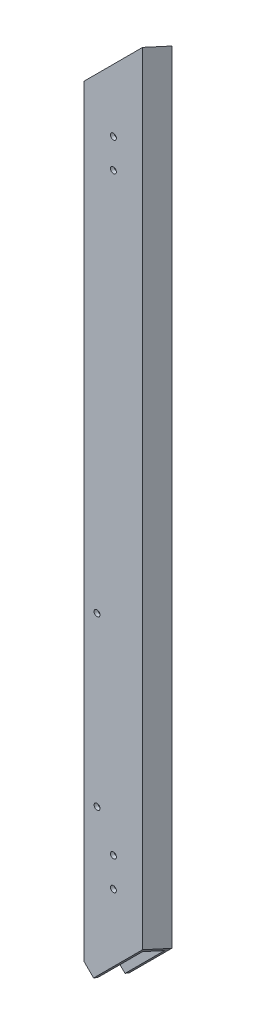
ISO-10303-21;
HEADER;
FILE_DESCRIPTION(('STEP AP214'),'2;1');
FILE_NAME('part.step','',(''),(''),'','','');
FILE_SCHEMA(('AUTOMOTIVE_DESIGN { 1 0 10303 214 1 1 1 1 }'));
ENDSEC;
DATA;
#1=APPLICATION_CONTEXT('core data for automotive mechanical design processes');
#2=APPLICATION_PROTOCOL_DEFINITION('international standard','automotive_design',2000,#1);
#3=PRODUCT_CONTEXT('',#1,'mechanical');
#4=PRODUCT('Part','Part','',(#3));
#5=PRODUCT_RELATED_PRODUCT_CATEGORY('part','',(#4));
#6=PRODUCT_DEFINITION_FORMATION('','',#4);
#7=PRODUCT_DEFINITION_CONTEXT('part definition',#1,'design');
#8=PRODUCT_DEFINITION('design','',#6,#7);
#9=PRODUCT_DEFINITION_SHAPE('','',#8);
#10=(LENGTH_UNIT() NAMED_UNIT(*) SI_UNIT(.MILLI.,.METRE.));
#11=(NAMED_UNIT(*) PLANE_ANGLE_UNIT() SI_UNIT($,.RADIAN.));
#12=(NAMED_UNIT(*) SI_UNIT($,.STERADIAN.) SOLID_ANGLE_UNIT());
#13=UNCERTAINTY_MEASURE_WITH_UNIT(LENGTH_MEASURE(1.E-05),#10,'distance_accuracy_value','');
#14=(GEOMETRIC_REPRESENTATION_CONTEXT(3) GLOBAL_UNCERTAINTY_ASSIGNED_CONTEXT((#13)) GLOBAL_UNIT_ASSIGNED_CONTEXT((#10,
#11,#12)) REPRESENTATION_CONTEXT('',''));
#15=CARTESIAN_POINT('',(0.,0.,0.));
#16=DIRECTION('',(0.,0.,1.));
#17=DIRECTION('',(1.,0.,0.));
#18=AXIS2_PLACEMENT_3D('',#15,#16,#17);
#19=CARTESIAN_POINT('',(-25.4,728.3704,12.7));
#20=DIRECTION('',(0.,0.,-1.));
#21=DIRECTION('',(-1.,0.,0.));
#22=AXIS2_PLACEMENT_3D('',#19,#20,#21);
#23=PLANE('',#22);
#24=CARTESIAN_POINT('',(-1.18245691016483E-10,81.4943735797498,12.7));
#25=DIRECTION('',(0.,0.,1.));
#26=DIRECTION('',(1.,0.,0.));
#27=AXIS2_PLACEMENT_3D('',#24,#25,#26);
#28=CIRCLE('',#27,2.57975099999999);
#29=CARTESIAN_POINT('',(2.57975099988174,81.4943735797498,12.7));
#30=VERTEX_POINT('',#29);
#31=EDGE_CURVE('E445',#30,#30,#28,.T.);
#32=ORIENTED_EDGE('',*,*,#31,.F.);
#33=EDGE_LOOP('',(#32));
#34=FACE_BOUND('',#33,.T.);
#35=CARTESIAN_POINT('',(-2.87367352136414E-10,623.076590260026,12.7));
#36=DIRECTION('',(0.,0.,-1.));
#37=DIRECTION('',(-1.,0.,0.));
#38=AXIS2_PLACEMENT_3D('',#35,#36,#37);
#39=CIRCLE('',#38,2.57975099999998);
#40=CARTESIAN_POINT('',(-2.57975100028735,623.076590260026,12.7));
#41=VERTEX_POINT('',#40);
#42=EDGE_CURVE('E460',#41,#41,#39,.T.);
#43=ORIENTED_EDGE('',*,*,#42,.T.);
#44=EDGE_LOOP('',(#43));
#45=FACE_BOUND('',#44,.T.);
#46=CARTESIAN_POINT('',(-2.88206958298787E-10,648.476590260026,12.7));
#47=DIRECTION('',(0.,0.,-1.));
#48=DIRECTION('',(-1.,0.,0.));
#49=AXIS2_PLACEMENT_3D('',#46,#47,#48);
#50=CIRCLE('',#49,2.57975099999998);
#51=CARTESIAN_POINT('',(-2.57975100028819,648.476590260026,12.7));
#52=VERTEX_POINT('',#51);
#53=EDGE_CURVE('E177',#52,#52,#50,.T.);
#54=ORIENTED_EDGE('',*,*,#53,.T.);
#55=EDGE_LOOP('',(#54));
#56=FACE_BOUND('',#55,.T.);
#57=CARTESIAN_POINT('',(-14.2367000000973,282.193999999979,12.7));
#58=DIRECTION('',(0.,0.,-1.));
#59=DIRECTION('',(-1.,0.,0.));
#60=AXIS2_PLACEMENT_3D('',#57,#58,#59);
#61=CIRCLE('',#60,2.57975099999998);
#62=CARTESIAN_POINT('',(-16.8164510000973,282.193999999979,12.7));
#63=VERTEX_POINT('',#62);
#64=EDGE_CURVE('E195',#63,#63,#61,.T.);
#65=ORIENTED_EDGE('',*,*,#64,.T.);
#66=EDGE_LOOP('',(#65));
#67=FACE_BOUND('',#66,.T.);
#68=CARTESIAN_POINT('',(-14.236700000129,136.397999999998,12.7));
#69=DIRECTION('',(0.,0.,-1.));
#70=DIRECTION('',(-1.,0.,0.));
#71=AXIS2_PLACEMENT_3D('',#68,#69,#70);
#72=CIRCLE('',#71,2.57975099999998);
#73=CARTESIAN_POINT('',(-16.816451000129,136.397999999998,12.7));
#74=VERTEX_POINT('',#73);
#75=EDGE_CURVE('E207',#74,#74,#72,.T.);
#76=ORIENTED_EDGE('',*,*,#75,.T.);
#77=EDGE_LOOP('',(#76));
#78=FACE_BOUND('',#77,.T.);
#79=DIRECTION('',(0.707106781186548,-0.707106781186548,0.));
#80=VECTOR('',#79,1.);
#81=CARTESIAN_POINT('',(-5.7023,-5.7023,12.7));
#82=LINE('',#81,#80);
#83=CARTESIAN_POINT('',(-25.4,13.9954,12.7));
#84=VERTEX_POINT('',#83);
#85=CARTESIAN_POINT('',(-17.2403241819029,5.83572418190286,12.7));
#86=VERTEX_POINT('',#85);
#87=EDGE_CURVE('E124',#84,#86,#82,.T.);
#88=ORIENTED_EDGE('',*,*,#87,.T.);
#89=DIRECTION('',(-0.707106781186548,-0.707106781186547,0.));
#90=VECTOR('',#89,1.);
#91=CARTESIAN_POINT('',(365.347175818097,388.423224181903,12.7));
#92=LINE('',#91,#90);
#93=CARTESIAN_POINT('',(25.4,48.4760483638057,12.7));
#94=VERTEX_POINT('',#93);
#95=EDGE_CURVE('E108',#94,#86,#92,.T.);
#96=ORIENTED_EDGE('',*,*,#95,.F.);
#97=DIRECTION('',(0.,-1.,0.));
#98=VECTOR('',#97,1.);
#99=CARTESIAN_POINT('',(25.4,728.3704,12.7));
#100=LINE('',#99,#98);
#101=CARTESIAN_POINT('',(25.3999999999999,728.3704,12.7));
#102=VERTEX_POINT('',#101);
#103=EDGE_CURVE('E168',#102,#94,#100,.T.);
#104=ORIENTED_EDGE('',*,*,#103,.F.);
#105=DIRECTION('',(-0.707106781186542,-0.707106781186553,0.));
#106=VECTOR('',#105,1.);
#107=CARTESIAN_POINT('',(-351.4852,351.485199999994,12.7));
#108=LINE('',#107,#106);
#109=CARTESIAN_POINT('',(-25.4,677.570399999999,12.7));
#110=VERTEX_POINT('',#109);
#111=EDGE_CURVE('E155',#102,#110,#108,.T.);
#112=ORIENTED_EDGE('',*,*,#111,.T.);
#113=DIRECTION('',(0.,-1.,0.));
#114=VECTOR('',#113,1.);
#115=CARTESIAN_POINT('',(-25.4,728.3704,12.7));
#116=LINE('',#115,#114);
#117=EDGE_CURVE('E134',#110,#84,#116,.T.);
#118=ORIENTED_EDGE('',*,*,#117,.T.);
#119=EDGE_LOOP('',(#88,#96,#104,#112,#118));
#120=FACE_BOUND('',#119,.T.);
#121=CARTESIAN_POINT('',(-1.19071419391048E-10,106.89437357975,12.7));
#122=DIRECTION('',(0.,0.,1.));
#123=DIRECTION('',(1.,0.,0.));
#124=AXIS2_PLACEMENT_3D('',#121,#122,#123);
#125=CIRCLE('',#124,2.57975099999999);
#126=CARTESIAN_POINT('',(2.57975099988092,106.89437357975,12.7));
#127=VERTEX_POINT('',#126);
#128=EDGE_CURVE('E437',#127,#127,#125,.T.);
#129=ORIENTED_EDGE('',*,*,#128,.F.);
#130=EDGE_LOOP('',(#129));
#131=FACE_BOUND('',#130,.T.);
#132=ADVANCED_FACE('F32',(#34,#45,#56,#67,#78,#120,#131),#23,.F.);
#133=CARTESIAN_POINT('',(-25.4,728.3704,-12.7));
#134=DIRECTION('',(0.,0.,1.));
#135=DIRECTION('',(1.,0.,0.));
#136=AXIS2_PLACEMENT_3D('',#133,#134,#135);
#137=PLANE('',#136);
#138=CARTESIAN_POINT('',(-1.19071419391048E-10,106.89437357975,-12.7));
#139=DIRECTION('',(0.,0.,1.));
#140=DIRECTION('',(1.,0.,0.));
#141=AXIS2_PLACEMENT_3D('',#138,#139,#140);
#142=CIRCLE('',#141,2.57975099999999);
#143=CARTESIAN_POINT('',(2.57975099988091,106.89437357975,-12.7));
#144=VERTEX_POINT('',#143);
#145=EDGE_CURVE('E436',#144,#144,#142,.T.);
#146=ORIENTED_EDGE('',*,*,#145,.T.);
#147=EDGE_LOOP('',(#146));
#148=FACE_BOUND('',#147,.T.);
#149=CARTESIAN_POINT('',(-1.18245691016483E-10,81.4943735797498,-12.7));
#150=DIRECTION('',(0.,0.,1.));
#151=DIRECTION('',(1.,0.,0.));
#152=AXIS2_PLACEMENT_3D('',#149,#150,#151);
#153=CIRCLE('',#152,2.57975099999999);
#154=CARTESIAN_POINT('',(2.57975099988174,81.4943735797498,-12.7));
#155=VERTEX_POINT('',#154);
#156=EDGE_CURVE('E448',#155,#155,#153,.T.);
#157=ORIENTED_EDGE('',*,*,#156,.T.);
#158=EDGE_LOOP('',(#157));
#159=FACE_BOUND('',#158,.T.);
#160=CARTESIAN_POINT('',(-2.87367352136414E-10,623.076590260026,-12.7));
#161=DIRECTION('',(0.,0.,-1.));
#162=DIRECTION('',(-1.,0.,0.));
#163=AXIS2_PLACEMENT_3D('',#160,#161,#162);
#164=CIRCLE('',#163,2.57975099999999);
#165=CARTESIAN_POINT('',(-2.57975100028735,623.076590260026,-12.7));
#166=VERTEX_POINT('',#165);
#167=EDGE_CURVE('E457',#166,#166,#164,.T.);
#168=ORIENTED_EDGE('',*,*,#167,.F.);
#169=EDGE_LOOP('',(#168));
#170=FACE_BOUND('',#169,.T.);
#171=CARTESIAN_POINT('',(-2.88206958298787E-10,648.476590260026,-12.7));
#172=DIRECTION('',(0.,0.,-1.));
#173=DIRECTION('',(-1.,0.,0.));
#174=AXIS2_PLACEMENT_3D('',#171,#172,#173);
#175=CIRCLE('',#174,2.57975099999999);
#176=CARTESIAN_POINT('',(-2.57975100028819,648.476590260026,-12.7));
#177=VERTEX_POINT('',#176);
#178=EDGE_CURVE('E184',#177,#177,#175,.T.);
#179=ORIENTED_EDGE('',*,*,#178,.F.);
#180=EDGE_LOOP('',(#179));
#181=FACE_BOUND('',#180,.T.);
#182=CARTESIAN_POINT('',(-14.2367000000973,282.193999999979,-12.7));
#183=DIRECTION('',(0.,0.,-1.));
#184=DIRECTION('',(-1.,0.,0.));
#185=AXIS2_PLACEMENT_3D('',#182,#183,#184);
#186=CIRCLE('',#185,2.57975099999999);
#187=CARTESIAN_POINT('',(-16.8164510000973,282.193999999979,-12.7));
#188=VERTEX_POINT('',#187);
#189=EDGE_CURVE('E181',#188,#188,#186,.T.);
#190=ORIENTED_EDGE('',*,*,#189,.F.);
#191=EDGE_LOOP('',(#190));
#192=FACE_BOUND('',#191,.T.);
#193=CARTESIAN_POINT('',(-14.236700000129,136.397999999998,-12.7));
#194=DIRECTION('',(0.,0.,-1.));
#195=DIRECTION('',(-1.,0.,0.));
#196=AXIS2_PLACEMENT_3D('',#193,#194,#195);
#197=CIRCLE('',#196,2.57975099999999);
#198=CARTESIAN_POINT('',(-16.816451000129,136.397999999998,-12.7));
#199=VERTEX_POINT('',#198);
#200=EDGE_CURVE('E204',#199,#199,#197,.T.);
#201=ORIENTED_EDGE('',*,*,#200,.F.);
#202=EDGE_LOOP('',(#201));
#203=FACE_BOUND('',#202,.T.);
#204=DIRECTION('',(0.,-1.,0.));
#205=VECTOR('',#204,1.);
#206=CARTESIAN_POINT('',(-25.4,728.3704,-12.7));
#207=LINE('',#206,#205);
#208=CARTESIAN_POINT('',(-25.4000000000001,665.898951636193,-12.7));
#209=VERTEX_POINT('',#208);
#210=CARTESIAN_POINT('',(-25.4,13.9954,-12.7));
#211=VERTEX_POINT('',#210);
#212=EDGE_CURVE('E171',#209,#211,#207,.T.);
#213=ORIENTED_EDGE('',*,*,#212,.F.);
#214=DIRECTION('',(0.707106781186542,0.707106781186553,0.));
#215=VECTOR('',#214,1.);
#216=CARTESIAN_POINT('',(-358.349475818097,332.949475818091,-12.7));
#217=LINE('',#216,#215);
#218=CARTESIAN_POINT('',(25.3999999999999,716.698951636194,-12.7));
#219=VERTEX_POINT('',#218);
#220=EDGE_CURVE('E221',#209,#219,#217,.T.);
#221=ORIENTED_EDGE('',*,*,#220,.T.);
#222=DIRECTION('',(0.,-1.,0.));
#223=VECTOR('',#222,1.);
#224=CARTESIAN_POINT('',(25.4,728.3704,-12.7));
#225=LINE('',#224,#223);
#226=CARTESIAN_POINT('',(25.3999999999999,36.8045999999999,-12.7));
#227=VERTEX_POINT('',#226);
#228=EDGE_CURVE('E41',#219,#227,#225,.T.);
#229=ORIENTED_EDGE('',*,*,#228,.T.);
#230=DIRECTION('',(0.707106781186547,0.707106781186547,0.));
#231=VECTOR('',#230,1.);
#232=CARTESIAN_POINT('',(-11.4046,0.,-12.7));
#233=LINE('',#232,#231);
#234=CARTESIAN_POINT('',(-11.4046,0.,-12.7));
#235=VERTEX_POINT('',#234);
#236=EDGE_CURVE('E153',#235,#227,#233,.T.);
#237=ORIENTED_EDGE('',*,*,#236,.F.);
#238=DIRECTION('',(0.707106781186548,-0.707106781186548,0.));
#239=VECTOR('',#238,1.);
#240=CARTESIAN_POINT('',(-5.7023,-5.7023,-12.7));
#241=LINE('',#240,#239);
#242=EDGE_CURVE('E135',#211,#235,#241,.T.);
#243=ORIENTED_EDGE('',*,*,#242,.F.);
#244=EDGE_LOOP('',(#213,#221,#229,#237,#243));
#245=FACE_BOUND('',#244,.T.);
#246=ADVANCED_FACE('F251',(#148,#159,#170,#181,#192,#203,#245),#137,.F.);
#247=CARTESIAN_POINT('',(-22.225,728.3704,9.525));
#248=DIRECTION('',(0.,0.,-1.));
#249=DIRECTION('',(-1.,0.,0.));
#250=AXIS2_PLACEMENT_3D('',#247,#248,#249);
#251=PLANE('',#250);
#252=CARTESIAN_POINT('',(-1.19071419391048E-10,106.89437357975,9.525));
#253=DIRECTION('',(0.,0.,-1.));
#254=DIRECTION('',(-1.,0.,0.));
#255=AXIS2_PLACEMENT_3D('',#252,#253,#254);
#256=CIRCLE('',#255,2.57975099999999);
#257=CARTESIAN_POINT('',(-2.57975100011906,106.89437357975,9.525));
#258=VERTEX_POINT('',#257);
#259=EDGE_CURVE('E439',#258,#258,#256,.T.);
#260=ORIENTED_EDGE('',*,*,#259,.F.);
#261=EDGE_LOOP('',(#260));
#262=FACE_BOUND('',#261,.T.);
#263=CARTESIAN_POINT('',(-1.18245691016483E-10,81.4943735797498,9.525));
#264=DIRECTION('',(0.,0.,-1.));
#265=DIRECTION('',(-1.,0.,0.));
#266=AXIS2_PLACEMENT_3D('',#263,#264,#265);
#267=CIRCLE('',#266,2.57975099999999);
#268=CARTESIAN_POINT('',(-2.57975100011823,81.4943735797498,9.525));
#269=VERTEX_POINT('',#268);
#270=EDGE_CURVE('E451',#269,#269,#267,.T.);
#271=ORIENTED_EDGE('',*,*,#270,.F.);
#272=EDGE_LOOP('',(#271));
#273=FACE_BOUND('',#272,.T.);
#274=CARTESIAN_POINT('',(-2.87367352136414E-10,623.076590260026,9.525));
#275=DIRECTION('',(0.,0.,-1.));
#276=DIRECTION('',(-1.,0.,0.));
#277=AXIS2_PLACEMENT_3D('',#274,#275,#276);
#278=CIRCLE('',#277,2.57975099999999);
#279=CARTESIAN_POINT('',(-2.57975100028735,623.076590260026,9.525));
#280=VERTEX_POINT('',#279);
#281=EDGE_CURVE('E189',#280,#280,#278,.T.);
#282=ORIENTED_EDGE('',*,*,#281,.F.);
#283=EDGE_LOOP('',(#282));
#284=FACE_BOUND('',#283,.T.);
#285=CARTESIAN_POINT('',(-2.88206958298787E-10,648.476590260026,9.525));
#286=DIRECTION('',(0.,0.,-1.));
#287=DIRECTION('',(-1.,0.,0.));
#288=AXIS2_PLACEMENT_3D('',#285,#286,#287);
#289=CIRCLE('',#288,2.57975099999999);
#290=CARTESIAN_POINT('',(-2.57975100028819,648.476590260026,9.525));
#291=VERTEX_POINT('',#290);
#292=EDGE_CURVE('E176',#291,#291,#289,.T.);
#293=ORIENTED_EDGE('',*,*,#292,.F.);
#294=EDGE_LOOP('',(#293));
#295=FACE_BOUND('',#294,.T.);
#296=CARTESIAN_POINT('',(-14.2367000000973,282.193999999979,9.525));
#297=DIRECTION('',(0.,0.,-1.));
#298=DIRECTION('',(-1.,0.,0.));
#299=AXIS2_PLACEMENT_3D('',#296,#297,#298);
#300=CIRCLE('',#299,2.57975099999999);
#301=CARTESIAN_POINT('',(-16.8164510000973,282.193999999979,9.525));
#302=VERTEX_POINT('',#301);
#303=EDGE_CURVE('E198',#302,#302,#300,.T.);
#304=ORIENTED_EDGE('',*,*,#303,.F.);
#305=EDGE_LOOP('',(#304));
#306=FACE_BOUND('',#305,.T.);
#307=CARTESIAN_POINT('',(-14.236700000129,136.397999999998,9.525));
#308=DIRECTION('',(0.,0.,-1.));
#309=DIRECTION('',(-1.,0.,0.));
#310=AXIS2_PLACEMENT_3D('',#307,#308,#309);
#311=CIRCLE('',#310,2.57975099999999);
#312=CARTESIAN_POINT('',(-16.816451000129,136.397999999998,9.525));
#313=VERTEX_POINT('',#312);
#314=EDGE_CURVE('E128',#313,#313,#311,.T.);
#315=ORIENTED_EDGE('',*,*,#314,.F.);
#316=EDGE_LOOP('',(#315));
#317=FACE_BOUND('',#316,.T.);
#318=DIRECTION('',(0.707106781186548,0.707106781186547,0.));
#319=VECTOR('',#318,1.);
#320=CARTESIAN_POINT('',(342.264141340835,363.881258659165,9.525));
#321=LINE('',#320,#319);
#322=CARTESIAN_POINT('',(-16.510858659165,5.106258659165,9.525));
#323=VERTEX_POINT('',#322);
#324=CARTESIAN_POINT('',(22.225,43.84211731833,9.52499999999995));
#325=VERTEX_POINT('',#324);
#326=EDGE_CURVE('E219',#323,#325,#321,.T.);
#327=ORIENTED_EDGE('',*,*,#326,.F.);
#328=DIRECTION('',(-0.707106781186548,0.707106781186548,0.));
#329=VECTOR('',#328,1.);
#330=CARTESIAN_POINT('',(-381.,369.5954,9.525));
#331=LINE('',#330,#329);
#332=CARTESIAN_POINT('',(-22.225,10.8204000000001,9.525));
#333=VERTEX_POINT('',#332);
#334=EDGE_CURVE('E127',#323,#333,#331,.T.);
#335=ORIENTED_EDGE('',*,*,#334,.T.);
#336=DIRECTION('',(0.,-1.,0.));
#337=VECTOR('',#336,1.);
#338=CARTESIAN_POINT('',(-22.225,728.3704,9.525));
#339=LINE('',#338,#337);
#340=CARTESIAN_POINT('',(-22.225,679.286468954524,9.525));
#341=VERTEX_POINT('',#340);
#342=EDGE_CURVE('E165',#341,#333,#339,.T.);
#343=ORIENTED_EDGE('',*,*,#342,.F.);
#344=DIRECTION('',(-0.707106781186542,-0.707106781186553,0.));
#345=VECTOR('',#344,1.);
#346=CARTESIAN_POINT('',(2.31696552273818,703.828434477262,9.525));
#347=LINE('',#346,#345);
#348=CARTESIAN_POINT('',(22.225,723.736468954524,9.525));
#349=VERTEX_POINT('',#348);
#350=EDGE_CURVE('E230',#349,#341,#347,.T.);
#351=ORIENTED_EDGE('',*,*,#350,.F.);
#352=DIRECTION('',(0.,-1.,0.));
#353=VECTOR('',#352,1.);
#354=CARTESIAN_POINT('',(22.225,728.3704,9.525));
#355=LINE('',#354,#353);
#356=EDGE_CURVE('E162',#349,#325,#355,.T.);
#357=ORIENTED_EDGE('',*,*,#356,.T.);
#358=EDGE_LOOP('',(#327,#335,#343,#351,#357));
#359=FACE_BOUND('',#358,.T.);
#360=ADVANCED_FACE('F249',(#262,#273,#284,#295,#306,#317,#359),#251,.T.);
#361=CARTESIAN_POINT('',(-22.225,728.3704,-9.525));
#362=DIRECTION('',(0.,0.,1.));
#363=DIRECTION('',(1.,0.,0.));
#364=AXIS2_PLACEMENT_3D('',#361,#362,#363);
#365=PLANE('',#364);
#366=CARTESIAN_POINT('',(-1.19071419391048E-10,106.89437357975,-9.525));
#367=DIRECTION('',(0.,0.,1.));
#368=DIRECTION('',(1.,0.,0.));
#369=AXIS2_PLACEMENT_3D('',#366,#367,#368);
#370=CIRCLE('',#369,2.57975099999999);
#371=CARTESIAN_POINT('',(2.57975099988092,106.89437357975,-9.525));
#372=VERTEX_POINT('',#371);
#373=EDGE_CURVE('E36',#372,#372,#370,.T.);
#374=ORIENTED_EDGE('',*,*,#373,.F.);
#375=EDGE_LOOP('',(#374));
#376=FACE_BOUND('',#375,.T.);
#377=CARTESIAN_POINT('',(-1.18245691016483E-10,81.4943735797498,-9.525));
#378=DIRECTION('',(0.,0.,1.));
#379=DIRECTION('',(1.,0.,0.));
#380=AXIS2_PLACEMENT_3D('',#377,#378,#379);
#381=CIRCLE('',#380,2.57975099999999);
#382=CARTESIAN_POINT('',(2.57975099988174,81.4943735797498,-9.525));
#383=VERTEX_POINT('',#382);
#384=EDGE_CURVE('E454',#383,#383,#381,.T.);
#385=ORIENTED_EDGE('',*,*,#384,.F.);
#386=EDGE_LOOP('',(#385));
#387=FACE_BOUND('',#386,.T.);
#388=CARTESIAN_POINT('',(-2.87367352136414E-10,623.076590260026,-9.525));
#389=DIRECTION('',(0.,0.,1.));
#390=DIRECTION('',(1.,0.,0.));
#391=AXIS2_PLACEMENT_3D('',#388,#389,#390);
#392=CIRCLE('',#391,2.57975099999999);
#393=CARTESIAN_POINT('',(2.57975099971262,623.076590260026,-9.525));
#394=VERTEX_POINT('',#393);
#395=EDGE_CURVE('E463',#394,#394,#392,.T.);
#396=ORIENTED_EDGE('',*,*,#395,.F.);
#397=EDGE_LOOP('',(#396));
#398=FACE_BOUND('',#397,.T.);
#399=CARTESIAN_POINT('',(-2.88206958298787E-10,648.476590260026,-9.525));
#400=DIRECTION('',(0.,0.,1.));
#401=DIRECTION('',(1.,0.,0.));
#402=AXIS2_PLACEMENT_3D('',#399,#400,#401);
#403=CIRCLE('',#402,2.57975099999999);
#404=CARTESIAN_POINT('',(2.57975099971178,648.476590260026,-9.525));
#405=VERTEX_POINT('',#404);
#406=EDGE_CURVE('E174',#405,#405,#403,.T.);
#407=ORIENTED_EDGE('',*,*,#406,.F.);
#408=EDGE_LOOP('',(#407));
#409=FACE_BOUND('',#408,.T.);
#410=CARTESIAN_POINT('',(-14.2367000000973,282.193999999979,-9.525));
#411=DIRECTION('',(0.,0.,1.));
#412=DIRECTION('',(1.,0.,0.));
#413=AXIS2_PLACEMENT_3D('',#410,#411,#412);
#414=CIRCLE('',#413,2.57975099999999);
#415=CARTESIAN_POINT('',(-11.6569490000973,282.193999999979,-9.525));
#416=VERTEX_POINT('',#415);
#417=EDGE_CURVE('E201',#416,#416,#414,.T.);
#418=ORIENTED_EDGE('',*,*,#417,.F.);
#419=EDGE_LOOP('',(#418));
#420=FACE_BOUND('',#419,.T.);
#421=CARTESIAN_POINT('',(-14.236700000129,136.397999999998,-9.525));
#422=DIRECTION('',(0.,0.,1.));
#423=DIRECTION('',(1.,0.,0.));
#424=AXIS2_PLACEMENT_3D('',#421,#422,#423);
#425=CIRCLE('',#424,2.57975099999999);
#426=CARTESIAN_POINT('',(-11.656949000129,136.397999999998,-9.525));
#427=VERTEX_POINT('',#426);
#428=EDGE_CURVE('E210',#427,#427,#425,.T.);
#429=ORIENTED_EDGE('',*,*,#428,.F.);
#430=EDGE_LOOP('',(#429));
#431=FACE_BOUND('',#430,.T.);
#432=DIRECTION('',(-0.707106781186548,-0.707106781186547,0.));
#433=VECTOR('',#432,1.);
#434=CARTESIAN_POINT('',(346.640934477262,359.504465522738,-9.52500000000001));
#435=LINE('',#434,#433);
#436=CARTESIAN_POINT('',(22.225,35.0885310454757,-9.52499999999995));
#437=VERTEX_POINT('',#436);
#438=CARTESIAN_POINT('',(-12.1340655227379,0.729465522737917,-9.52499999999999));
#439=VERTEX_POINT('',#438);
#440=EDGE_CURVE('E48',#437,#439,#435,.T.);
#441=ORIENTED_EDGE('',*,*,#440,.F.);
#442=DIRECTION('',(0.,-1.,0.));
#443=VECTOR('',#442,1.);
#444=CARTESIAN_POINT('',(22.225,728.3704,-9.525));
#445=LINE('',#444,#443);
#446=CARTESIAN_POINT('',(22.225,714.98288268167,-9.525));
#447=VERTEX_POINT('',#446);
#448=EDGE_CURVE('E159',#447,#437,#445,.T.);
#449=ORIENTED_EDGE('',*,*,#448,.F.);
#450=DIRECTION('',(0.707106781186542,0.707106781186553,0.));
#451=VECTOR('',#450,1.);
#452=CARTESIAN_POINT('',(6.69375865916537,699.451641340835,-9.525));
#453=LINE('',#452,#451);
#454=CARTESIAN_POINT('',(-22.225,670.532882681669,-9.525));
#455=VERTEX_POINT('',#454);
#456=EDGE_CURVE('E56',#455,#447,#453,.T.);
#457=ORIENTED_EDGE('',*,*,#456,.F.);
#458=DIRECTION('',(0.,-1.,0.));
#459=VECTOR('',#458,1.);
#460=CARTESIAN_POINT('',(-22.225,728.3704,-9.525));
#461=LINE('',#460,#459);
#462=CARTESIAN_POINT('',(-22.225,10.8204000000001,-9.525));
#463=VERTEX_POINT('',#462);
#464=EDGE_CURVE('E157',#455,#463,#461,.T.);
#465=ORIENTED_EDGE('',*,*,#464,.T.);
#466=DIRECTION('',(0.707106781186548,-0.707106781186548,0.));
#467=VECTOR('',#466,1.);
#468=CARTESIAN_POINT('',(-381.,369.5954,-9.52499999999998));
#469=LINE('',#468,#467);
#470=EDGE_CURVE('E149',#463,#439,#469,.T.);
#471=ORIENTED_EDGE('',*,*,#470,.T.);
#472=EDGE_LOOP('',(#441,#449,#457,#465,#471));
#473=FACE_BOUND('',#472,.T.);
#474=ADVANCED_FACE('F241',(#376,#387,#398,#409,#420,#431,#473),#365,.T.);
#475=CARTESIAN_POINT('',(-25.4,728.3704,12.7));
#476=DIRECTION('',(1.,0.,0.));
#477=DIRECTION('',(0.,0.,-1.));
#478=AXIS2_PLACEMENT_3D('',#475,#476,#477);
#479=PLANE('',#478);
#480=ORIENTED_EDGE('',*,*,#117,.F.);
#481=DIRECTION('',(0.,-0.417534970247208,-0.908660854566028));
#482=VECTOR('',#481,1.);
#483=CARTESIAN_POINT('',(-25.4,686.42664093007,31.9734022901025));
#484=LINE('',#483,#482);
#485=EDGE_CURVE('E136',#110,#209,#484,.T.);
#486=ORIENTED_EDGE('',*,*,#485,.T.);
#487=ORIENTED_EDGE('',*,*,#212,.T.);
#488=DIRECTION('',(0.,0.,1.));
#489=VECTOR('',#488,1.);
#490=CARTESIAN_POINT('',(-25.4,13.9954,-12.7));
#491=LINE('',#490,#489);
#492=EDGE_CURVE('E139',#211,#84,#491,.T.);
#493=ORIENTED_EDGE('',*,*,#492,.T.);
#494=EDGE_LOOP('',(#480,#486,#487,#493));
#495=FACE_BOUND('',#494,.T.);
#496=ADVANCED_FACE('F258',(#495),#479,.F.);
#497=CARTESIAN_POINT('',(-22.225,728.3704,9.525));
#498=DIRECTION('',(1.,0.,0.));
#499=DIRECTION('',(0.,0.,-1.));
#500=AXIS2_PLACEMENT_3D('',#497,#498,#499);
#501=PLANE('',#500);
#502=DIRECTION('',(0.,-0.417534970247208,-0.908660854566028));
#503=VECTOR('',#502,1.);
#504=CARTESIAN_POINT('',(-22.225,687.843538228809,28.1473297051005));
#505=LINE('',#504,#503);
#506=EDGE_CURVE('E142',#341,#455,#505,.T.);
#507=ORIENTED_EDGE('',*,*,#506,.F.);
#508=ORIENTED_EDGE('',*,*,#342,.T.);
#509=DIRECTION('',(0.,0.,-1.));
#510=VECTOR('',#509,1.);
#511=CARTESIAN_POINT('',(-22.225,10.8204000000001,9.525));
#512=LINE('',#511,#510);
#513=EDGE_CURVE('E146',#333,#463,#512,.T.);
#514=ORIENTED_EDGE('',*,*,#513,.T.);
#515=ORIENTED_EDGE('',*,*,#464,.F.);
#516=EDGE_LOOP('',(#507,#508,#514,#515));
#517=FACE_BOUND('',#516,.T.);
#518=ADVANCED_FACE('F243',(#517),#501,.T.);
#519=CARTESIAN_POINT('',(22.225,728.3704,9.525));
#520=DIRECTION('',(-1.,0.,0.));
#521=DIRECTION('',(0.,0.,1.));
#522=AXIS2_PLACEMENT_3D('',#519,#520,#521);
#523=PLANE('',#522);
#524=DIRECTION('',(0.,-0.417534970247204,-0.908660854566029));
#525=VECTOR('',#524,1.);
#526=CARTESIAN_POINT('',(22.225,163.179664461559,269.233444312531));
#527=LINE('',#526,#525);
#528=EDGE_CURVE('E216',#325,#437,#527,.T.);
#529=ORIENTED_EDGE('',*,*,#528,.F.);
#530=ORIENTED_EDGE('',*,*,#356,.F.);
#531=DIRECTION('',(0.,0.417534970247208,0.908660854566027));
#532=VECTOR('',#531,1.);
#533=CARTESIAN_POINT('',(22.225,724.544327414998,11.2831027012608));
#534=LINE('',#533,#532);
#535=EDGE_CURVE('E227',#447,#349,#534,.T.);
#536=ORIENTED_EDGE('',*,*,#535,.F.);
#537=ORIENTED_EDGE('',*,*,#448,.T.);
#538=EDGE_LOOP('',(#529,#530,#536,#537));
#539=FACE_BOUND('',#538,.T.);
#540=ADVANCED_FACE('F246',(#539),#523,.T.);
#541=CARTESIAN_POINT('',(25.4,728.3704,12.7));
#542=DIRECTION('',(-1.,0.,0.));
#543=DIRECTION('',(0.,0.,1.));
#544=AXIS2_PLACEMENT_3D('',#541,#542,#543);
#545=PLANE('',#544);
#546=ORIENTED_EDGE('',*,*,#103,.T.);
#547=DIRECTION('',(0.,-0.417534970247204,-0.908660854566029));
#548=VECTOR('',#547,1.);
#549=CARTESIAN_POINT('',(25.4,167.005737046561,270.65034161127));
#550=LINE('',#549,#548);
#551=EDGE_CURVE('E114',#94,#227,#550,.T.);
#552=ORIENTED_EDGE('',*,*,#551,.T.);
#553=ORIENTED_EDGE('',*,*,#228,.F.);
#554=DIRECTION('',(0.,0.417534970247208,0.908660854566028));
#555=VECTOR('',#554,1.);
#556=CARTESIAN_POINT('',(25.4,728.3704,12.7));
#557=LINE('',#556,#555);
#558=EDGE_CURVE('E224',#219,#102,#557,.T.);
#559=ORIENTED_EDGE('',*,*,#558,.T.);
#560=EDGE_LOOP('',(#546,#552,#553,#559));
#561=FACE_BOUND('',#560,.T.);
#562=ADVANCED_FACE('F34',(#561),#545,.F.);
#563=CARTESIAN_POINT('',(-5.7023,-5.7023,-12.7));
#564=DIRECTION('',(-0.707106781186548,-0.707106781186548,0.));
#565=DIRECTION('',(0.707106781186548,-0.707106781186548,0.));
#566=AXIS2_PLACEMENT_3D('',#563,#564,#565);
#567=PLANE('',#566);
#568=DIRECTION('',(0.218508012224406,-0.218508012224407,-0.951056516295155));
#569=VECTOR('',#568,1.);
#570=CARTESIAN_POINT('',(-11.4046,0.,-12.7));
#571=LINE('',#570,#569);
#572=EDGE_CURVE('E111',#86,#323,#571,.T.);
#573=ORIENTED_EDGE('',*,*,#572,.F.);
#574=ORIENTED_EDGE('',*,*,#87,.F.);
#575=ORIENTED_EDGE('',*,*,#492,.F.);
#576=ORIENTED_EDGE('',*,*,#242,.T.);
#577=DIRECTION('',(0.218508012224407,-0.218508012224407,-0.951056516295155));
#578=VECTOR('',#577,1.);
#579=CARTESIAN_POINT('',(-10.8600788035122,-0.544521196487826,-15.0700294872883));
#580=LINE('',#579,#578);
#581=EDGE_CURVE('E11',#439,#235,#580,.T.);
#582=ORIENTED_EDGE('',*,*,#581,.F.);
#583=ORIENTED_EDGE('',*,*,#470,.F.);
#584=ORIENTED_EDGE('',*,*,#513,.F.);
#585=ORIENTED_EDGE('',*,*,#334,.F.);
#586=EDGE_LOOP('',(#573,#574,#575,#576,#582,#583,#584,#585));
#587=FACE_BOUND('',#586,.T.);
#588=ADVANCED_FACE('F122',(#587),#567,.T.);
#589=CARTESIAN_POINT('',(-364.1852,338.785199999994,12.7));
#590=DIRECTION('',(0.672498511963964,-0.672498511963953,0.309016994374942));
#591=DIRECTION('',(0.707106781186542,0.707106781186553,0.));
#592=AXIS2_PLACEMENT_3D('',#589,#590,#591);
#593=PLANE('',#592);
#594=ORIENTED_EDGE('',*,*,#506,.T.);
#595=ORIENTED_EDGE('',*,*,#456,.T.);
#596=ORIENTED_EDGE('',*,*,#535,.T.);
#597=ORIENTED_EDGE('',*,*,#350,.T.);
#598=EDGE_LOOP('',(#594,#595,#596,#597));
#599=FACE_BOUND('',#598,.T.);
#600=ORIENTED_EDGE('',*,*,#111,.F.);
#601=ORIENTED_EDGE('',*,*,#558,.F.);
#602=ORIENTED_EDGE('',*,*,#220,.F.);
#603=ORIENTED_EDGE('',*,*,#485,.F.);
#604=EDGE_LOOP('',(#600,#601,#602,#603));
#605=FACE_BOUND('',#604,.T.);
#606=ADVANCED_FACE('F233',(#599,#605),#593,.F.);
#607=CARTESIAN_POINT('',(371.1829,382.5875,-12.7));
#608=DIRECTION('',(-0.672498511963959,0.672498511963959,-0.309016994374942));
#609=DIRECTION('',(-0.707106781186548,-0.707106781186547,0.));
#610=AXIS2_PLACEMENT_3D('',#607,#608,#609);
#611=PLANE('',#610);
#612=ORIENTED_EDGE('',*,*,#326,.T.);
#613=ORIENTED_EDGE('',*,*,#528,.T.);
#614=ORIENTED_EDGE('',*,*,#440,.T.);
#615=ORIENTED_EDGE('',*,*,#581,.T.);
#616=ORIENTED_EDGE('',*,*,#236,.T.);
#617=ORIENTED_EDGE('',*,*,#551,.F.);
#618=ORIENTED_EDGE('',*,*,#95,.T.);
#619=ORIENTED_EDGE('',*,*,#572,.T.);
#620=EDGE_LOOP('',(#612,#613,#614,#615,#616,#617,#618,#619));
#621=FACE_BOUND('',#620,.T.);
#622=ADVANCED_FACE('F110',(#621),#611,.F.);
#623=CARTESIAN_POINT('',(-14.236700000129,136.397999999998,-12.7));
#624=DIRECTION('',(0.,0.,-1.));
#625=DIRECTION('',(-1.,0.,0.));
#626=AXIS2_PLACEMENT_3D('',#623,#624,#625);
#627=CYLINDRICAL_SURFACE('',#626,2.57975099999999);
#628=ORIENTED_EDGE('',*,*,#314,.T.);
#629=EDGE_LOOP('',(#628));
#630=FACE_BOUND('',#629,.T.);
#631=ORIENTED_EDGE('',*,*,#75,.F.);
#632=EDGE_LOOP('',(#631));
#633=FACE_BOUND('',#632,.T.);
#634=ADVANCED_FACE('F291',(#630,#633),#627,.F.);
#635=ORIENTED_EDGE('',*,*,#428,.T.);
#636=EDGE_LOOP('',(#635));
#637=FACE_BOUND('',#636,.T.);
#638=ORIENTED_EDGE('',*,*,#200,.T.);
#639=EDGE_LOOP('',(#638));
#640=FACE_BOUND('',#639,.T.);
#641=ADVANCED_FACE('F324',(#637,#640),#627,.F.);
#642=CARTESIAN_POINT('',(-14.2367000000973,282.193999999979,-12.7));
#643=DIRECTION('',(0.,0.,-1.));
#644=DIRECTION('',(-1.,0.,0.));
#645=AXIS2_PLACEMENT_3D('',#642,#643,#644);
#646=CYLINDRICAL_SURFACE('',#645,2.57975099999999);
#647=ORIENTED_EDGE('',*,*,#303,.T.);
#648=EDGE_LOOP('',(#647));
#649=FACE_BOUND('',#648,.T.);
#650=ORIENTED_EDGE('',*,*,#64,.F.);
#651=EDGE_LOOP('',(#650));
#652=FACE_BOUND('',#651,.T.);
#653=ADVANCED_FACE('F332',(#649,#652),#646,.F.);
#654=ORIENTED_EDGE('',*,*,#417,.T.);
#655=EDGE_LOOP('',(#654));
#656=FACE_BOUND('',#655,.T.);
#657=ORIENTED_EDGE('',*,*,#189,.T.);
#658=EDGE_LOOP('',(#657));
#659=FACE_BOUND('',#658,.T.);
#660=ADVANCED_FACE('F340',(#656,#659),#646,.F.);
#661=CARTESIAN_POINT('',(-2.88206958298787E-10,648.476590260026,-12.7));
#662=DIRECTION('',(0.,0.,-1.));
#663=DIRECTION('',(-1.,0.,0.));
#664=AXIS2_PLACEMENT_3D('',#661,#662,#663);
#665=CYLINDRICAL_SURFACE('',#664,2.57975099999999);
#666=ORIENTED_EDGE('',*,*,#406,.T.);
#667=EDGE_LOOP('',(#666));
#668=FACE_BOUND('',#667,.T.);
#669=ORIENTED_EDGE('',*,*,#178,.T.);
#670=EDGE_LOOP('',(#669));
#671=FACE_BOUND('',#670,.T.);
#672=ADVANCED_FACE('F349',(#668,#671),#665,.F.);
#673=ORIENTED_EDGE('',*,*,#292,.T.);
#674=EDGE_LOOP('',(#673));
#675=FACE_BOUND('',#674,.T.);
#676=ORIENTED_EDGE('',*,*,#53,.F.);
#677=EDGE_LOOP('',(#676));
#678=FACE_BOUND('',#677,.T.);
#679=ADVANCED_FACE('F357',(#675,#678),#665,.F.);
#680=CARTESIAN_POINT('',(-2.87367352136414E-10,623.076590260026,-12.7));
#681=DIRECTION('',(0.,0.,-1.));
#682=DIRECTION('',(-1.,0.,0.));
#683=AXIS2_PLACEMENT_3D('',#680,#681,#682);
#684=CYLINDRICAL_SURFACE('',#683,2.57975099999999);
#685=ORIENTED_EDGE('',*,*,#395,.T.);
#686=EDGE_LOOP('',(#685));
#687=FACE_BOUND('',#686,.T.);
#688=ORIENTED_EDGE('',*,*,#167,.T.);
#689=EDGE_LOOP('',(#688));
#690=FACE_BOUND('',#689,.T.);
#691=ADVANCED_FACE('F365',(#687,#690),#684,.F.);
#692=ORIENTED_EDGE('',*,*,#281,.T.);
#693=EDGE_LOOP('',(#692));
#694=FACE_BOUND('',#693,.T.);
#695=ORIENTED_EDGE('',*,*,#42,.F.);
#696=EDGE_LOOP('',(#695));
#697=FACE_BOUND('',#696,.T.);
#698=ADVANCED_FACE('F373',(#694,#697),#684,.F.);
#699=CARTESIAN_POINT('',(-1.18245691016483E-10,81.4943735797498,12.7));
#700=DIRECTION('',(0.,0.,1.));
#701=DIRECTION('',(1.,0.,0.));
#702=AXIS2_PLACEMENT_3D('',#699,#700,#701);
#703=CYLINDRICAL_SURFACE('',#702,2.57975099999999);
#704=ORIENTED_EDGE('',*,*,#270,.T.);
#705=EDGE_LOOP('',(#704));
#706=FACE_BOUND('',#705,.T.);
#707=ORIENTED_EDGE('',*,*,#31,.T.);
#708=EDGE_LOOP('',(#707));
#709=FACE_BOUND('',#708,.T.);
#710=ADVANCED_FACE('F382',(#706,#709),#703,.F.);
#711=ORIENTED_EDGE('',*,*,#384,.T.);
#712=EDGE_LOOP('',(#711));
#713=FACE_BOUND('',#712,.T.);
#714=ORIENTED_EDGE('',*,*,#156,.F.);
#715=EDGE_LOOP('',(#714));
#716=FACE_BOUND('',#715,.T.);
#717=ADVANCED_FACE('F390',(#713,#716),#703,.F.);
#718=CARTESIAN_POINT('',(-1.19071419391048E-10,106.89437357975,12.7));
#719=DIRECTION('',(0.,0.,1.));
#720=DIRECTION('',(1.,0.,0.));
#721=AXIS2_PLACEMENT_3D('',#718,#719,#720);
#722=CYLINDRICAL_SURFACE('',#721,2.57975099999999);
#723=ORIENTED_EDGE('',*,*,#259,.T.);
#724=EDGE_LOOP('',(#723));
#725=FACE_BOUND('',#724,.T.);
#726=ORIENTED_EDGE('',*,*,#128,.T.);
#727=EDGE_LOOP('',(#726));
#728=FACE_BOUND('',#727,.T.);
#729=ADVANCED_FACE('F399',(#725,#728),#722,.F.);
#730=ORIENTED_EDGE('',*,*,#373,.T.);
#731=EDGE_LOOP('',(#730));
#732=FACE_BOUND('',#731,.T.);
#733=ORIENTED_EDGE('',*,*,#145,.F.);
#734=EDGE_LOOP('',(#733));
#735=FACE_BOUND('',#734,.T.);
#736=ADVANCED_FACE('F407',(#732,#735),#722,.F.);
#737=CLOSED_SHELL('',(#132,#246,#360,#474,#496,#518,#540,#562,#588,#606,#622,#634,#641,#653,
#660,#672,#679,#691,#698,#710,#717,#729,#736));
#738=MANIFOLD_SOLID_BREP('B2',#737);
#739=ADVANCED_BREP_SHAPE_REPRESENTATION('',(#18,#738),#14);
#740=SHAPE_DEFINITION_REPRESENTATION(#9,#739);
ENDSEC;
END-ISO-10303-21;
